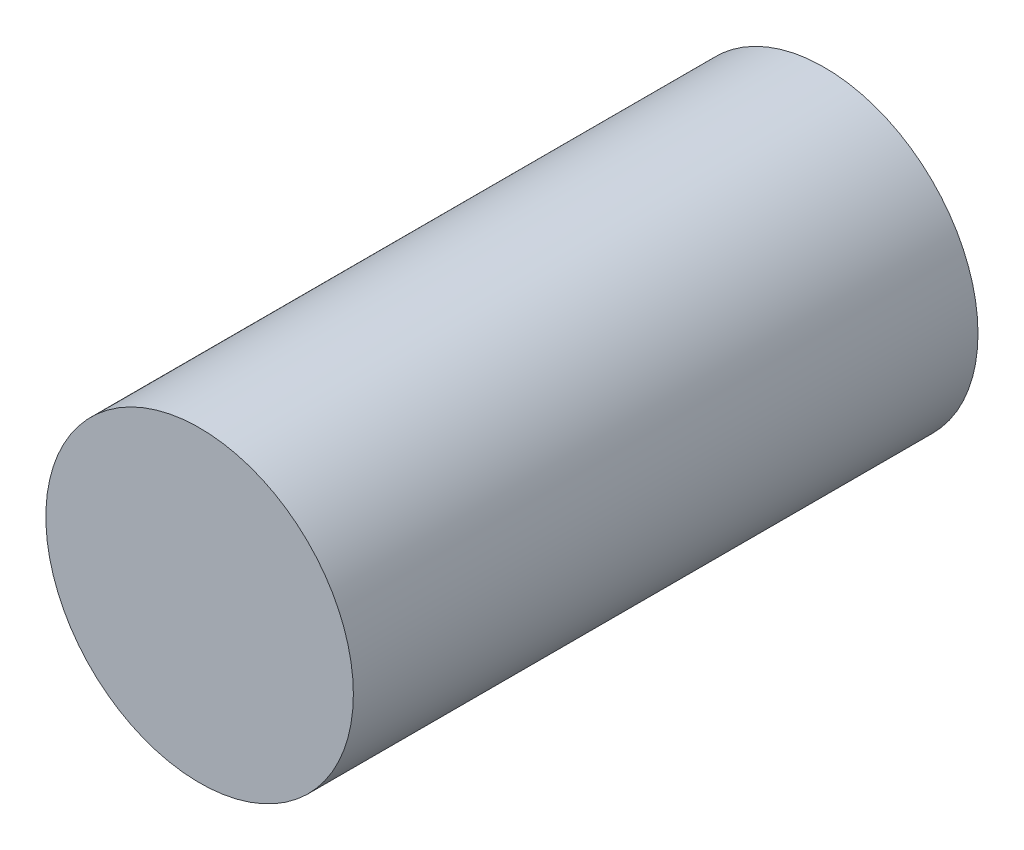
ISO-10303-21;
HEADER;
FILE_DESCRIPTION(('STEP AP214'),'2;1');
FILE_NAME('part.step','',(''),(''),'','','');
FILE_SCHEMA(('AUTOMOTIVE_DESIGN { 1 0 10303 214 1 1 1 1 }'));
ENDSEC;
DATA;
#1=APPLICATION_CONTEXT('core data for automotive mechanical design processes');
#2=APPLICATION_PROTOCOL_DEFINITION('international standard','automotive_design',2000,#1);
#3=PRODUCT_CONTEXT('',#1,'mechanical');
#4=PRODUCT('Part','Part','',(#3));
#5=PRODUCT_RELATED_PRODUCT_CATEGORY('part','',(#4));
#6=PRODUCT_DEFINITION_FORMATION('','',#4);
#7=PRODUCT_DEFINITION_CONTEXT('part definition',#1,'design');
#8=PRODUCT_DEFINITION('design','',#6,#7);
#9=PRODUCT_DEFINITION_SHAPE('','',#8);
#10=(LENGTH_UNIT() NAMED_UNIT(*) SI_UNIT(.MILLI.,.METRE.));
#11=(NAMED_UNIT(*) PLANE_ANGLE_UNIT() SI_UNIT($,.RADIAN.));
#12=(NAMED_UNIT(*) SI_UNIT($,.STERADIAN.) SOLID_ANGLE_UNIT());
#13=UNCERTAINTY_MEASURE_WITH_UNIT(LENGTH_MEASURE(1.E-05),#10,'distance_accuracy_value','');
#14=(GEOMETRIC_REPRESENTATION_CONTEXT(3) GLOBAL_UNCERTAINTY_ASSIGNED_CONTEXT((#13)) GLOBAL_UNIT_ASSIGNED_CONTEXT((#10,
#11,#12)) REPRESENTATION_CONTEXT('',''));
#15=CARTESIAN_POINT('',(0.,0.,0.));
#16=DIRECTION('',(0.,0.,1.));
#17=DIRECTION('',(1.,0.,0.));
#18=AXIS2_PLACEMENT_3D('',#15,#16,#17);
#19=CARTESIAN_POINT('',(0.,0.,65.));
#20=DIRECTION('',(0.,0.,-1.));
#21=DIRECTION('',(-1.,0.,0.));
#22=AXIS2_PLACEMENT_3D('',#19,#20,#21);
#23=CYLINDRICAL_SURFACE('',#22,16.);
#24=CARTESIAN_POINT('',(0.,0.,65.));
#25=DIRECTION('',(0.,0.,1.));
#26=DIRECTION('',(1.,0.,0.));
#27=AXIS2_PLACEMENT_3D('',#24,#25,#26);
#28=CIRCLE('',#27,16.);
#29=CARTESIAN_POINT('',(16.,0.,65.));
#30=VERTEX_POINT('',#29);
#31=EDGE_CURVE('E10',#30,#30,#28,.T.);
#32=ORIENTED_EDGE('',*,*,#31,.F.);
#33=EDGE_LOOP('',(#32));
#34=FACE_BOUND('',#33,.T.);
#35=CARTESIAN_POINT('',(0.,0.,0.));
#36=DIRECTION('',(0.,0.,1.));
#37=DIRECTION('',(1.,0.,0.));
#38=AXIS2_PLACEMENT_3D('',#35,#36,#37);
#39=CIRCLE('',#38,16.);
#40=CARTESIAN_POINT('',(16.,0.,0.));
#41=VERTEX_POINT('',#40);
#42=EDGE_CURVE('E34',#41,#41,#39,.T.);
#43=ORIENTED_EDGE('',*,*,#42,.T.);
#44=EDGE_LOOP('',(#43));
#45=FACE_BOUND('',#44,.T.);
#46=ADVANCED_FACE('F31',(#34,#45),#23,.T.);
#47=CARTESIAN_POINT('',(0.,0.,65.));
#48=DIRECTION('',(0.,0.,1.));
#49=DIRECTION('',(1.,0.,0.));
#50=AXIS2_PLACEMENT_3D('',#47,#48,#49);
#51=PLANE('',#50);
#52=ORIENTED_EDGE('',*,*,#31,.T.);
#53=EDGE_LOOP('',(#52));
#54=FACE_BOUND('',#53,.T.);
#55=ADVANCED_FACE('F46',(#54),#51,.T.);
#56=CARTESIAN_POINT('',(0.,0.,0.));
#57=DIRECTION('',(0.,0.,1.));
#58=DIRECTION('',(1.,0.,0.));
#59=AXIS2_PLACEMENT_3D('',#56,#57,#58);
#60=PLANE('',#59);
#61=ORIENTED_EDGE('',*,*,#42,.F.);
#62=EDGE_LOOP('',(#61));
#63=FACE_BOUND('',#62,.T.);
#64=ADVANCED_FACE('F44',(#63),#60,.F.);
#65=CLOSED_SHELL('',(#46,#55,#64));
#66=MANIFOLD_SOLID_BREP('B2',#65);
#67=ADVANCED_BREP_SHAPE_REPRESENTATION('',(#18,#66),#14);
#68=SHAPE_DEFINITION_REPRESENTATION(#9,#67);
ENDSEC;
END-ISO-10303-21;
